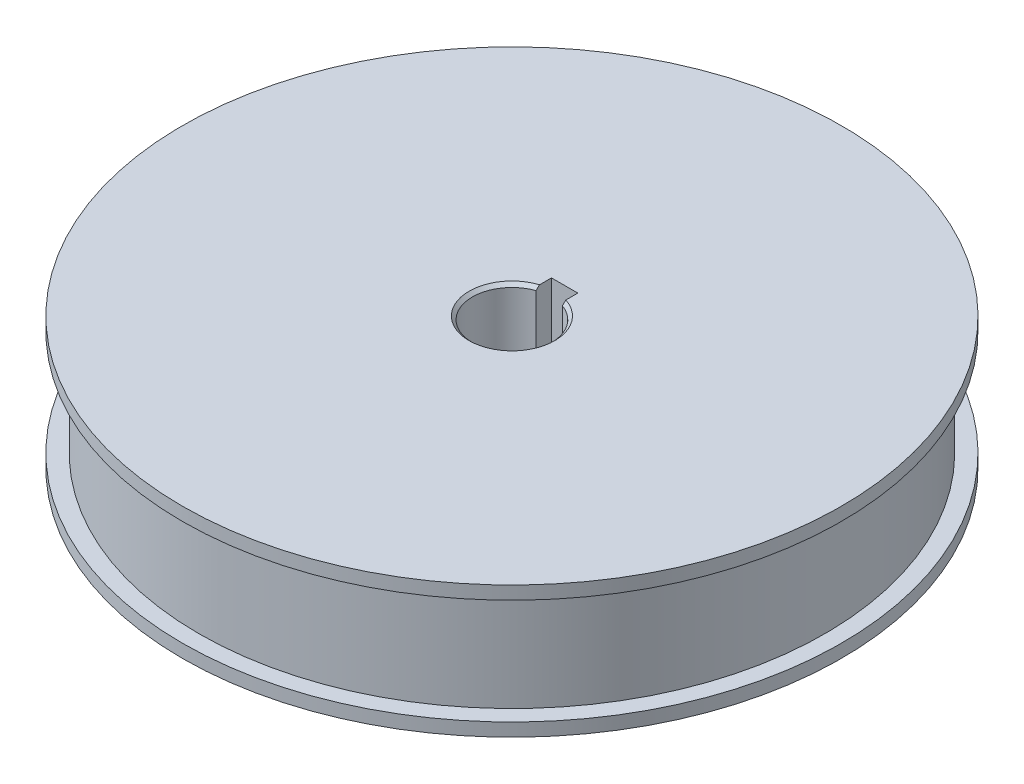
ISO-10303-21;
HEADER;
FILE_DESCRIPTION(('STEP AP214'),'2;1');
FILE_NAME('part.step','',(''),(''),'','','');
FILE_SCHEMA(('AUTOMOTIVE_DESIGN { 1 0 10303 214 1 1 1 1 }'));
ENDSEC;
DATA;
#1=APPLICATION_CONTEXT('core data for automotive mechanical design processes');
#2=APPLICATION_PROTOCOL_DEFINITION('international standard','automotive_design',2000,#1);
#3=PRODUCT_CONTEXT('',#1,'mechanical');
#4=PRODUCT('Part','Part','',(#3));
#5=PRODUCT_RELATED_PRODUCT_CATEGORY('part','',(#4));
#6=PRODUCT_DEFINITION_FORMATION('','',#4);
#7=PRODUCT_DEFINITION_CONTEXT('part definition',#1,'design');
#8=PRODUCT_DEFINITION('design','',#6,#7);
#9=PRODUCT_DEFINITION_SHAPE('','',#8);
#10=(LENGTH_UNIT() NAMED_UNIT(*) SI_UNIT(.MILLI.,.METRE.));
#11=(NAMED_UNIT(*) PLANE_ANGLE_UNIT() SI_UNIT($,.RADIAN.));
#12=(NAMED_UNIT(*) SI_UNIT($,.STERADIAN.) SOLID_ANGLE_UNIT());
#13=UNCERTAINTY_MEASURE_WITH_UNIT(LENGTH_MEASURE(1.E-05),#10,'distance_accuracy_value','');
#14=(GEOMETRIC_REPRESENTATION_CONTEXT(3) GLOBAL_UNCERTAINTY_ASSIGNED_CONTEXT((#13)) GLOBAL_UNIT_ASSIGNED_CONTEXT((#10,
#11,#12)) REPRESENTATION_CONTEXT('',''));
#15=CARTESIAN_POINT('',(0.,0.,0.));
#16=DIRECTION('',(0.,0.,1.));
#17=DIRECTION('',(1.,0.,0.));
#18=AXIS2_PLACEMENT_3D('',#15,#16,#17);
#19=CARTESIAN_POINT('',(0.,20.,0.));
#20=DIRECTION('',(0.,-1.,0.));
#21=DIRECTION('',(0.,0.,-1.));
#22=AXIS2_PLACEMENT_3D('',#19,#20,#21);
#23=CYLINDRICAL_SURFACE('',#22,50.);
#24=CARTESIAN_POINT('',(0.,0.,0.));
#25=DIRECTION('',(0.,1.,0.));
#26=DIRECTION('',(0.,0.,1.));
#27=AXIS2_PLACEMENT_3D('',#24,#25,#26);
#28=CIRCLE('',#27,50.);
#29=CARTESIAN_POINT('',(0.,0.,50.));
#30=VERTEX_POINT('',#29);
#31=EDGE_CURVE('E156',#30,#30,#28,.T.);
#32=ORIENTED_EDGE('',*,*,#31,.T.);
#33=EDGE_LOOP('',(#32));
#34=FACE_BOUND('',#33,.T.);
#35=CARTESIAN_POINT('',(0.,2.,0.));
#36=DIRECTION('',(0.,1.,0.));
#37=DIRECTION('',(0.,0.,1.));
#38=AXIS2_PLACEMENT_3D('',#35,#36,#37);
#39=CIRCLE('',#38,50.);
#40=CARTESIAN_POINT('',(0.,2.,50.));
#41=VERTEX_POINT('',#40);
#42=EDGE_CURVE('E159',#41,#41,#39,.T.);
#43=ORIENTED_EDGE('',*,*,#42,.F.);
#44=EDGE_LOOP('',(#43));
#45=FACE_BOUND('',#44,.T.);
#46=ADVANCED_FACE('F33',(#34,#45),#23,.T.);
#47=CARTESIAN_POINT('',(0.,0.,0.));
#48=DIRECTION('',(0.,1.,0.));
#49=DIRECTION('',(0.,0.,1.));
#50=AXIS2_PLACEMENT_3D('',#47,#48,#49);
#51=PLANE('',#50);
#52=DIRECTION('',(-1.,0.,0.));
#53=VECTOR('',#52,1.);
#54=CARTESIAN_POINT('',(2.,0.,-8.));
#55=LINE('',#54,#53);
#56=CARTESIAN_POINT('',(2.,0.,-8.));
#57=VERTEX_POINT('',#56);
#58=CARTESIAN_POINT('',(-2.,0.,-8.));
#59=VERTEX_POINT('',#58);
#60=EDGE_CURVE('E100',#57,#59,#55,.T.);
#61=ORIENTED_EDGE('',*,*,#60,.T.);
#62=DIRECTION('',(0.,0.,1.));
#63=VECTOR('',#62,1.);
#64=CARTESIAN_POINT('',(-2.,0.,0.342964167323017));
#65=LINE('',#64,#63);
#66=CARTESIAN_POINT('',(-2.,0.,-6.18465843842645));
#67=VERTEX_POINT('',#66);
#68=EDGE_CURVE('E113',#59,#67,#65,.T.);
#69=ORIENTED_EDGE('',*,*,#68,.T.);
#70=CARTESIAN_POINT('',(0.,0.,0.));
#71=DIRECTION('',(0.,1.,0.));
#72=DIRECTION('',(0.,0.,1.));
#73=AXIS2_PLACEMENT_3D('',#70,#71,#72);
#74=CIRCLE('',#73,6.49999999999996);
#75=CARTESIAN_POINT('',(2.,0.,-6.18465843842645));
#76=VERTEX_POINT('',#75);
#77=EDGE_CURVE('E112',#67,#76,#74,.T.);
#78=ORIENTED_EDGE('',*,*,#77,.T.);
#79=DIRECTION('',(0.,0.,-1.));
#80=VECTOR('',#79,1.);
#81=CARTESIAN_POINT('',(2.,0.,0.342964167323017));
#82=LINE('',#81,#80);
#83=EDGE_CURVE('E92',#76,#57,#82,.T.);
#84=ORIENTED_EDGE('',*,*,#83,.T.);
#85=EDGE_LOOP('',(#61,#69,#78,#84));
#86=FACE_BOUND('',#85,.T.);
#87=ORIENTED_EDGE('',*,*,#31,.F.);
#88=EDGE_LOOP('',(#87));
#89=FACE_BOUND('',#88,.T.);
#90=ADVANCED_FACE('F109',(#86,#89),#51,.F.);
#91=CARTESIAN_POINT('',(0.,2.,0.));
#92=DIRECTION('',(0.,1.,0.));
#93=DIRECTION('',(0.,0.,1.));
#94=AXIS2_PLACEMENT_3D('',#91,#92,#93);
#95=PLANE('',#94);
#96=CARTESIAN_POINT('',(0.,2.,0.));
#97=DIRECTION('',(0.,1.,0.));
#98=DIRECTION('',(0.,0.,1.));
#99=AXIS2_PLACEMENT_3D('',#96,#97,#98);
#100=CIRCLE('',#99,47.5);
#101=CARTESIAN_POINT('',(0.,2.,47.5));
#102=VERTEX_POINT('',#101);
#103=EDGE_CURVE('E165',#102,#102,#100,.T.);
#104=ORIENTED_EDGE('',*,*,#103,.F.);
#105=EDGE_LOOP('',(#104));
#106=FACE_BOUND('',#105,.T.);
#107=ORIENTED_EDGE('',*,*,#42,.T.);
#108=EDGE_LOOP('',(#107));
#109=FACE_BOUND('',#108,.T.);
#110=ADVANCED_FACE('F199',(#106,#109),#95,.T.);
#111=CARTESIAN_POINT('',(0.,18.,0.));
#112=DIRECTION('',(0.,1.,0.));
#113=DIRECTION('',(0.,0.,1.));
#114=AXIS2_PLACEMENT_3D('',#111,#112,#113);
#115=PLANE('',#114);
#116=CARTESIAN_POINT('',(0.,18.,0.));
#117=DIRECTION('',(0.,1.,0.));
#118=DIRECTION('',(0.,0.,1.));
#119=AXIS2_PLACEMENT_3D('',#116,#117,#118);
#120=CIRCLE('',#119,47.5);
#121=CARTESIAN_POINT('',(0.,18.,47.5));
#122=VERTEX_POINT('',#121);
#123=EDGE_CURVE('E168',#122,#122,#120,.T.);
#124=ORIENTED_EDGE('',*,*,#123,.T.);
#125=EDGE_LOOP('',(#124));
#126=FACE_BOUND('',#125,.T.);
#127=CARTESIAN_POINT('',(0.,18.,0.));
#128=DIRECTION('',(0.,1.,0.));
#129=DIRECTION('',(0.,0.,1.));
#130=AXIS2_PLACEMENT_3D('',#127,#128,#129);
#131=CIRCLE('',#130,50.);
#132=CARTESIAN_POINT('',(0.,18.,50.));
#133=VERTEX_POINT('',#132);
#134=EDGE_CURVE('E162',#133,#133,#131,.T.);
#135=ORIENTED_EDGE('',*,*,#134,.F.);
#136=EDGE_LOOP('',(#135));
#137=FACE_BOUND('',#136,.T.);
#138=ADVANCED_FACE('F213',(#126,#137),#115,.F.);
#139=CARTESIAN_POINT('',(0.,2.,0.));
#140=DIRECTION('',(0.,1.,0.));
#141=DIRECTION('',(0.,0.,1.));
#142=AXIS2_PLACEMENT_3D('',#139,#140,#141);
#143=CYLINDRICAL_SURFACE('',#142,47.5);
#144=ORIENTED_EDGE('',*,*,#103,.T.);
#145=EDGE_LOOP('',(#144));
#146=FACE_BOUND('',#145,.T.);
#147=ORIENTED_EDGE('',*,*,#123,.F.);
#148=EDGE_LOOP('',(#147));
#149=FACE_BOUND('',#148,.T.);
#150=ADVANCED_FACE('F207',(#146,#149),#143,.T.);
#151=CARTESIAN_POINT('',(0.,20.,0.));
#152=DIRECTION('',(0.,1.,0.));
#153=DIRECTION('',(0.,0.,1.));
#154=AXIS2_PLACEMENT_3D('',#151,#152,#153);
#155=PLANE('',#154);
#156=DIRECTION('',(0.,0.,1.));
#157=VECTOR('',#156,1.);
#158=CARTESIAN_POINT('',(-2.,20.,0.342964167323017));
#159=LINE('',#158,#157);
#160=CARTESIAN_POINT('',(-2.,20.,-8.));
#161=VERTEX_POINT('',#160);
#162=CARTESIAN_POINT('',(-2.,20.,-6.18465843842651));
#163=VERTEX_POINT('',#162);
#164=EDGE_CURVE('E118',#161,#163,#159,.T.);
#165=ORIENTED_EDGE('',*,*,#164,.F.);
#166=DIRECTION('',(-1.,0.,0.));
#167=VECTOR('',#166,1.);
#168=CARTESIAN_POINT('',(2.,20.,-8.));
#169=LINE('',#168,#167);
#170=CARTESIAN_POINT('',(2.,20.,-8.));
#171=VERTEX_POINT('',#170);
#172=EDGE_CURVE('E115',#171,#161,#169,.T.);
#173=ORIENTED_EDGE('',*,*,#172,.F.);
#174=DIRECTION('',(0.,0.,-1.));
#175=VECTOR('',#174,1.);
#176=CARTESIAN_POINT('',(2.,20.,0.342964167323017));
#177=LINE('',#176,#175);
#178=CARTESIAN_POINT('',(2.,20.,-6.18465843842651));
#179=VERTEX_POINT('',#178);
#180=EDGE_CURVE('E95',#179,#171,#177,.T.);
#181=ORIENTED_EDGE('',*,*,#180,.F.);
#182=CARTESIAN_POINT('',(0.,20.,0.));
#183=DIRECTION('',(0.,1.,0.));
#184=DIRECTION('',(0.,0.,1.));
#185=AXIS2_PLACEMENT_3D('',#182,#183,#184);
#186=CIRCLE('',#185,6.50000000000002);
#187=EDGE_CURVE('E145',#179,#163,#186,.F.);
#188=ORIENTED_EDGE('',*,*,#187,.T.);
#189=EDGE_LOOP('',(#165,#173,#181,#188));
#190=FACE_BOUND('',#189,.T.);
#191=CARTESIAN_POINT('',(0.,20.,0.));
#192=DIRECTION('',(0.,1.,0.));
#193=DIRECTION('',(0.,0.,1.));
#194=AXIS2_PLACEMENT_3D('',#191,#192,#193);
#195=CIRCLE('',#194,50.);
#196=CARTESIAN_POINT('',(0.,20.,50.));
#197=VERTEX_POINT('',#196);
#198=EDGE_CURVE('E155',#197,#197,#195,.T.);
#199=ORIENTED_EDGE('',*,*,#198,.T.);
#200=EDGE_LOOP('',(#199));
#201=FACE_BOUND('',#200,.T.);
#202=ADVANCED_FACE('F185',(#190,#201),#155,.T.);
#203=ORIENTED_EDGE('',*,*,#134,.T.);
#204=EDGE_LOOP('',(#203));
#205=FACE_BOUND('',#204,.T.);
#206=ORIENTED_EDGE('',*,*,#198,.F.);
#207=EDGE_LOOP('',(#206));
#208=FACE_BOUND('',#207,.T.);
#209=ADVANCED_FACE('F193',(#205,#208),#23,.T.);
#210=CARTESIAN_POINT('',(0.,0.,0.));
#211=DIRECTION('',(0.,1.,0.));
#212=DIRECTION('',(0.,0.,1.));
#213=AXIS2_PLACEMENT_3D('',#210,#211,#212);
#214=CYLINDRICAL_SURFACE('',#213,6.);
#215=CARTESIAN_POINT('',(0.,0.499999999999969,0.));
#216=DIRECTION('',(0.,1.,0.));
#217=DIRECTION('',(0.,0.,1.));
#218=AXIS2_PLACEMENT_3D('',#215,#216,#217);
#219=CIRCLE('',#218,6.);
#220=CARTESIAN_POINT('',(2.,0.499999999999969,-5.65685424949238));
#221=VERTEX_POINT('',#220);
#222=CARTESIAN_POINT('',(-2.,0.499999999999969,-5.65685424949238));
#223=VERTEX_POINT('',#222);
#224=EDGE_CURVE('E148',#221,#223,#219,.F.);
#225=ORIENTED_EDGE('',*,*,#224,.T.);
#226=DIRECTION('',(0.,1.,0.));
#227=VECTOR('',#226,1.);
#228=CARTESIAN_POINT('',(-2.,0.,-5.65685424949238));
#229=LINE('',#228,#227);
#230=CARTESIAN_POINT('',(-2.,19.5,-5.65685424949238));
#231=VERTEX_POINT('',#230);
#232=EDGE_CURVE('E60',#223,#231,#229,.T.);
#233=ORIENTED_EDGE('',*,*,#232,.T.);
#234=CARTESIAN_POINT('',(0.,19.5,0.));
#235=DIRECTION('',(0.,1.,0.));
#236=DIRECTION('',(0.,0.,1.));
#237=AXIS2_PLACEMENT_3D('',#234,#235,#236);
#238=CIRCLE('',#237,6.);
#239=CARTESIAN_POINT('',(2.,19.5,-5.65685424949238));
#240=VERTEX_POINT('',#239);
#241=EDGE_CURVE('E151',#231,#240,#238,.T.);
#242=ORIENTED_EDGE('',*,*,#241,.T.);
#243=DIRECTION('',(0.,1.,0.));
#244=VECTOR('',#243,1.);
#245=CARTESIAN_POINT('',(2.,0.,-5.65685424949238));
#246=LINE('',#245,#244);
#247=EDGE_CURVE('E53',#240,#221,#246,.F.);
#248=ORIENTED_EDGE('',*,*,#247,.T.);
#249=EDGE_LOOP('',(#225,#233,#242,#248));
#250=FACE_BOUND('',#249,.T.);
#251=ADVANCED_FACE('F178',(#250),#214,.F.);
#252=CARTESIAN_POINT('',(0.,0.,0.));
#253=DIRECTION('',(0.,-1.,0.));
#254=DIRECTION('',(0.,0.,-1.));
#255=AXIS2_PLACEMENT_3D('',#252,#253,#254);
#256=CONICAL_SURFACE('',#255,6.49999999999996,0.785398163397442);
#257=CARTESIAN_POINT('',(-2.,1.61219853949245,4.45988824045397));
#258=CARTESIAN_POINT('',(-2.,1.73160057225468,4.32899011369741));
#259=CARTESIAN_POINT('',(-2.,1.85056308903736,4.19768461100457));
#260=CARTESIAN_POINT('',(-2.,2.08726565906151,3.93391719229734));
#261=CARTESIAN_POINT('',(-2.,2.20500539441447,3.80145499127349));
#262=CARTESIAN_POINT('',(-2.,2.43969910927223,3.53414060830021));
#263=CARTESIAN_POINT('',(-2.,2.55664134359573,3.39927808842488));
#264=CARTESIAN_POINT('',(-2.,2.78825316106572,3.127638499899));
#265=CARTESIAN_POINT('',(-2.,2.90292304645967,2.99086169005596));
#266=CARTESIAN_POINT('',(-2.,3.11213084814838,2.7353600215693));
#267=CARTESIAN_POINT('',(-2.,3.20711197924624,2.61699922173352));
#268=CARTESIAN_POINT('',(-2.,3.3938514240401,2.37776497397293));
#269=CARTESIAN_POINT('',(-2.,3.48561008501234,2.25689179904818));
#270=CARTESIAN_POINT('',(-2.,3.66439216862294,2.01188713856589));
#271=CARTESIAN_POINT('',(-2.,3.75142098300241,1.8877596127775));
#272=CARTESIAN_POINT('',(-2.,3.91853651086337,1.63493155293843));
#273=CARTESIAN_POINT('',(-2.,3.99862775346176,1.50623408090329));
#274=CARTESIAN_POINT('',(-2.,4.10958063467165,1.31029101943208));
#275=CARTESIAN_POINT('',(-2.,4.14460499315393,1.24542093565854));
#276=CARTESIAN_POINT('',(-2.,4.21137082813927,1.11401979859999));
#277=CARTESIAN_POINT('',(-2.,4.2431116718963,1.04748842823361));
#278=CARTESIAN_POINT('',(-2.,4.33206214489695,0.845313798015475));
#279=CARTESIAN_POINT('',(-2.,4.38319962235176,0.706754073601495));
#280=CARTESIAN_POINT('',(-2.,4.43739564157709,0.507342393878112));
#281=CARTESIAN_POINT('',(-2.,4.45095785902955,0.449303455964828));
#282=CARTESIAN_POINT('',(-2.,4.4733877046244,0.33233526442306));
#283=CARTESIAN_POINT('',(-2.,4.48225768211542,0.273406471565288));
#284=CARTESIAN_POINT('',(-2.,4.49485693183785,0.15508721821775));
#285=CARTESIAN_POINT('',(-2.,4.49859409193038,0.0956976074721));
#286=CARTESIAN_POINT('',(-2.,4.50074862203906,-0.0231805731579565));
#287=CARTESIAN_POINT('',(-2.,4.4991659564945,-0.0826691437012093));
#288=CARTESIAN_POINT('',(-2.,4.49077679957134,-0.20116021652316));
#289=CARTESIAN_POINT('',(-2.,4.48397996201615,-0.260163413631012));
#290=CARTESIAN_POINT('',(-2.,4.46552667480977,-0.377407356251951));
#291=CARTESIAN_POINT('',(-2.,4.45386911941681,-0.435647925167084));
#292=CARTESIAN_POINT('',(-2.,4.42619592536784,-0.551197583851442));
#293=CARTESIAN_POINT('',(-2.,4.41017140301754,-0.608504519708594));
#294=CARTESIAN_POINT('',(-2.,4.3743771185397,-0.721920663509619));
#295=CARTESIAN_POINT('',(-2.,4.35460744386474,-0.778029899386801));
#296=CARTESIAN_POINT('',(-2.,4.30484491880407,-0.90739085041634));
#297=CARTESIAN_POINT('',(-2.,4.27363380956965,-0.980171948387721));
#298=CARTESIAN_POINT('',(-2.,4.20682027827652,-1.12370429686066));
#299=CARTESIAN_POINT('',(-2.,4.17121560537904,-1.19445448385073));
#300=CARTESIAN_POINT('',(-2.,4.09652028280135,-1.33424550496522));
#301=CARTESIAN_POINT('',(-2.,4.05742326062341,-1.40328290800829));
#302=CARTESIAN_POINT('',(-2.,3.97653851955975,-1.53976578360353));
#303=CARTESIAN_POINT('',(-2.,3.93475040628739,-1.60721102083118));
#304=CARTESIAN_POINT('',(-2.,3.84869069773078,-1.74129415102359));
#305=CARTESIAN_POINT('',(-2.,3.80440116604976,-1.80792047750683));
#306=CARTESIAN_POINT('',(-2.,3.71409789436585,-1.93999261528823));
#307=CARTESIAN_POINT('',(-2.,3.66808410193195,-2.00543839059863));
#308=CARTESIAN_POINT('',(-2.,3.57472308074126,-2.13524623127281));
#309=CARTESIAN_POINT('',(-2.,3.52737757205937,-2.19960953717343));
#310=CARTESIAN_POINT('',(-2.,3.43155148379208,-2.32747983180517));
#311=CARTESIAN_POINT('',(-2.,3.38307094315218,-2.39098684979994));
#312=CARTESIAN_POINT('',(-2.,3.2237752593542,-2.5964946011706));
#313=CARTESIAN_POINT('',(-2.,3.11105814905099,-2.73702084589685));
#314=CARTESIAN_POINT('',(-2.,2.88243857479556,-3.01546454371718));
#315=CARTESIAN_POINT('',(-2.,2.76653571004763,-3.15338166484171));
#316=CARTESIAN_POINT('',(-2.,2.5324351476168,-3.4273363698164));
#317=CARTESIAN_POINT('',(-2.,2.41423663670568,-3.56337325727129));
#318=CARTESIAN_POINT('',(-2.,2.17618407248154,-3.83399275017562));
#319=CARTESIAN_POINT('',(-2.,2.05632997605792,-3.96857531759203));
#320=CARTESIAN_POINT('',(-2.,1.69458161651471,-4.37104314109603));
#321=CARTESIAN_POINT('',(-2.,1.45083577632547,-4.63726233478265));
#322=CARTESIAN_POINT('',(-2.,0.9604324594057,-5.16688171006759));
#323=CARTESIAN_POINT('',(-2.,0.713775631542884,-5.43028249583973));
#324=CARTESIAN_POINT('',(-2.,0.219628499894256,-5.95403724989811));
#325=CARTESIAN_POINT('',(-2.,-0.0278528962180387,-6.21439963003504));
#326=CARTESIAN_POINT('',(-2.,-0.524169948264208,-6.73385597358412));
#327=CARTESIAN_POINT('',(-2.,-0.773005678360163,-6.99294986602891));
#328=CARTESIAN_POINT('',(-2.,-1.27148732458179,-7.51004188490894));
#329=CARTESIAN_POINT('',(-2.,-1.52113263197186,-7.76804059853803));
#330=CARTESIAN_POINT('',(-2.,-2.02114182797931,-8.28334078464484));
#331=CARTESIAN_POINT('',(-2.,-2.27150571713954,-8.54064225659556));
#332=CARTESIAN_POINT('',(-2.,-2.65469969361488,-8.93361228298925));
#333=CARTESIAN_POINT('',(-2.,-2.78733170977238,-9.06947408992298));
#334=CARTESIAN_POINT('',(-2.,-3.05274477408878,-9.34107945740285));
#335=CARTESIAN_POINT('',(-2.,-3.18552583620758,-9.47682300430818));
#336=CARTESIAN_POINT('',(-2.,-3.45135596100367,-9.74834609038349));
#337=CARTESIAN_POINT('',(-2.,-3.58440515719579,-9.88412549882043));
#338=CARTESIAN_POINT('',(-2.,-3.85059551613597,-10.1555664279706));
#339=CARTESIAN_POINT('',(-2.,-3.98373666787464,-10.2912279594799));
#340=CARTESIAN_POINT('',(-2.,-4.11692407313095,-10.4268440467203));
#341=B_SPLINE_CURVE_WITH_KNOTS('',3,(#257,#258,#259,#260,#261,#262,#263,#264,#265,#266,#267,
#268,#269,#270,#271,#272,#273,#274,#275,#276,#277,#278,#279,#280,#281,#282,#283,#284,#285,#286,
#287,#288,#289,#290,#291,#292,#293,#294,#295,#296,#297,#298,#299,#300,#301,#302,#303,#304,#305,
#306,#307,#308,#309,#310,#311,#312,#313,#314,#315,#316,#317,#318,#319,#320,#321,#322,#323,#324,
#325,#326,#327,#328,#329,#330,#331,#332,#333,#334,#335,#336,#337,#338,#339,#340),.UNSPECIFIED.,
.F.,.F.,(4,2,2,2,2,2,2,2,2,2,2,2,2,2,2,2,2,2,2,2,2,2,2,2,2,2,2,2,2,2,2,2,2,2,2,2,2,2,2,2,2,4),
(0.,0.531532800104079,1.06320048846525,1.59869277855567,2.13411335759058,2.58935213474305,
3.04454170064137,3.49920099832056,3.95356120377446,4.17463437668464,4.39575007220395,
4.83681348384999,5.01546676449134,5.19403051069923,5.37231954073346,5.55060976255398,
5.72857068172189,5.90657210648615,6.08493837695391,6.26330048292644,6.50067719750104,
6.73817602988312,6.97611744289256,7.21409380656477,7.45407234096785,7.69405817852275,
7.93374711955648,8.17342784834479,8.71378626964112,9.25421298674594,9.79483477299652,
10.3354706634045,11.4182748776934,12.5008421268164,13.5784805496539,14.6561785889065,
15.7331981047259,16.8102184343717,17.3798209760955,17.9494822650366,18.5197832035638,
19.0900248030533),.UNSPECIFIED.);
#342=EDGE_CURVE('E171',#223,#67,#341,.T.);
#343=ORIENTED_EDGE('',*,*,#342,.F.);
#344=ORIENTED_EDGE('',*,*,#224,.F.);
#345=CARTESIAN_POINT('',(2.,-4.11692407313095,-10.4268440467203));
#346=CARTESIAN_POINT('',(2.,-3.85202515936052,-10.1571023080294));
#347=CARTESIAN_POINT('',(2.,-3.58729863804241,-9.88719081066195));
#348=CARTESIAN_POINT('',(2.,-3.05797214945071,-9.34654685306115));
#349=CARTESIAN_POINT('',(2.,-2.79337280849998,-9.0758137797134));
#350=CARTESIAN_POINT('',(2.,-2.25874894420904,-8.52756944785167));
#351=CARTESIAN_POINT('',(2.,-1.98873843460707,-8.25004451756953));
#352=CARTESIAN_POINT('',(2.,-1.44992460173528,-7.69453582748563));
#353=CARTESIAN_POINT('',(2.,-1.1811201548436,-7.41655315835108));
#354=CARTESIAN_POINT('',(2.,-0.682974243380568,-6.89922202345327));
#355=CARTESIAN_POINT('',(2.,-0.45347725443928,-6.66002339323314));
#356=CARTESIAN_POINT('',(2.,0.00437928087560684,-6.18046866542998));
#357=CARTESIAN_POINT('',(2.,0.232738648093766,-5.94011239657435));
#358=CARTESIAN_POINT('',(2.,0.688968515011236,-5.45660459018517));
#359=CARTESIAN_POINT('',(2.,0.916830533467052,-5.21344504262601));
#360=CARTESIAN_POINT('',(2.,1.36997587422681,-4.72499129668505));
#361=CARTESIAN_POINT('',(2.,1.59526063599425,-4.4796984396151));
#362=CARTESIAN_POINT('',(2.,1.9280019823299,-4.11166588182012));
#363=CARTESIAN_POINT('',(2.,2.03692758091937,-3.99025528525912));
#364=CARTESIAN_POINT('',(2.,2.25357617960902,-3.74636702329595));
#365=CARTESIAN_POINT('',(2.,2.36129919646389,-3.62388937280268));
#366=CARTESIAN_POINT('',(2.,2.57542832660804,-3.3772793203824));
#367=CARTESIAN_POINT('',(2.,2.68183074718853,-3.25314370434691));
#368=CARTESIAN_POINT('',(2.,2.89250066151554,-3.00309750154677));
#369=CARTESIAN_POINT('',(2.,2.99676844412284,-2.87718715888536));
#370=CARTESIAN_POINT('',(2.,3.20133882649366,-2.62424401698871));
#371=CARTESIAN_POINT('',(2.,3.30167062082191,-2.49723497439838));
#372=CARTESIAN_POINT('',(2.,3.49824932113247,-2.2399575215414));
#373=CARTESIAN_POINT('',(2.,3.5944937192554,-2.10968718600972));
#374=CARTESIAN_POINT('',(2.,3.78043068619411,-1.8452432925981));
#375=CARTESIAN_POINT('',(2.,3.87014802721925,-1.71108752164307));
#376=CARTESIAN_POINT('',(2.,3.99734057547431,-1.50537945514365));
#377=CARTESIAN_POINT('',(2.,4.0384876623721,-1.43610225807613));
#378=CARTESIAN_POINT('',(2.,4.1176320233952,-1.29577923499182));
#379=CARTESIAN_POINT('',(2.,4.15563034937219,-1.2247340099857));
#380=CARTESIAN_POINT('',(2.,4.20707850492364,-1.12169806046594));
#381=CARTESIAN_POINT('',(2.,4.22217634123454,-1.09052658547134));
#382=CARTESIAN_POINT('',(2.,4.25154151755371,-1.02778171028063));
#383=CARTESIAN_POINT('',(2.,4.26580859774857,-0.996208188069378));
#384=CARTESIAN_POINT('',(2.,4.29341241233352,-0.9326562543702));
#385=CARTESIAN_POINT('',(2.,4.30674916372379,-0.900677850293427));
#386=CARTESIAN_POINT('',(2.,4.33238724140896,-0.836311295861495));
#387=CARTESIAN_POINT('',(2.,4.34468860996275,-0.803923162291467));
#388=CARTESIAN_POINT('',(2.,4.37957529298804,-0.706969524010819));
#389=CARTESIAN_POINT('',(2.,4.40050511373331,-0.641793724194985));
#390=CARTESIAN_POINT('',(2.,4.43698844324685,-0.509926685960209));
#391=CARTESIAN_POINT('',(2.,4.45254150468695,-0.443235321943141));
#392=CARTESIAN_POINT('',(2.,4.47563715505322,-0.318221709920715));
#393=CARTESIAN_POINT('',(2.,4.48400252483829,-0.260052603225496));
#394=CARTESIAN_POINT('',(2.,4.49572002905261,-0.143222422036379));
#395=CARTESIAN_POINT('',(2.,4.49907383553637,-0.084561518196953));
#396=CARTESIAN_POINT('',(2.,4.50059130770833,0.0328027447906741));
#397=CARTESIAN_POINT('',(2.,4.49875728076068,0.0915060734588462));
#398=CARTESIAN_POINT('',(2.,4.49000522758415,0.208537617000397));
#399=CARTESIAN_POINT('',(2.,4.48308599970052,0.266865739924182));
#400=CARTESIAN_POINT('',(2.,4.46182848062896,0.399458602786358));
#401=CARTESIAN_POINT('',(2.,4.44592700484639,0.47347304753199));
#402=CARTESIAN_POINT('',(2.,4.40737583003711,0.619732056134578));
#403=CARTESIAN_POINT('',(2.,4.38472157895893,0.691975390418867));
#404=CARTESIAN_POINT('',(2.,4.33376774844008,0.834895213932325));
#405=CARTESIAN_POINT('',(2.,4.30543567423359,0.905559954814699));
#406=CARTESIAN_POINT('',(2.,4.24435755598113,1.04491186091865));
#407=CARTESIAN_POINT('',(2.,4.21161240424251,1.11359942251984));
#408=CARTESIAN_POINT('',(2.,4.11898520527817,1.29574813474842));
#409=CARTESIAN_POINT('',(2.,4.05590573725121,1.40757554489782));
#410=CARTESIAN_POINT('',(2.,3.9231210763619,1.62725093074807));
#411=CARTESIAN_POINT('',(2.,3.85341072879622,1.73509571853254));
#412=CARTESIAN_POINT('',(2.,3.70923615968444,1.94794770463543));
#413=CARTESIAN_POINT('',(2.,3.63475999771598,2.05294675624234));
#414=CARTESIAN_POINT('',(2.,3.48256784869033,2.26050101482551));
#415=CARTESIAN_POINT('',(2.,3.40485288415533,2.36305697727826));
#416=CARTESIAN_POINT('',(2.,3.24672814740809,2.56669184397754));
#417=CARTESIAN_POINT('',(2.,3.16630920580189,2.66776359933968));
#418=CARTESIAN_POINT('',(2.,3.00364765519351,2.86843448950422));
#419=CARTESIAN_POINT('',(2.,2.92140492673219,2.96803352712629));
#420=CARTESIAN_POINT('',(2.,2.67283107060704,3.26481029636765));
#421=CARTESIAN_POINT('',(2.,2.50442941582736,3.46025193007642));
#422=CARTESIAN_POINT('',(2.,2.21503187212977,3.79013784222473));
#423=CARTESIAN_POINT('',(2.,2.09490935345996,3.92535560089502));
#424=CARTESIAN_POINT('',(2.,1.85407281596989,4.19381458757091));
#425=CARTESIAN_POINT('',(2.,1.73336657942019,4.32706279073908));
#426=CARTESIAN_POINT('',(2.,1.61219853949246,4.45988824045397));
#427=B_SPLINE_CURVE_WITH_KNOTS('',3,(#345,#346,#347,#348,#349,#350,#351,#352,#353,#354,#355,
#356,#357,#358,#359,#360,#361,#362,#363,#364,#365,#366,#367,#368,#369,#370,#371,#372,#373,#374,
#375,#376,#377,#378,#379,#380,#381,#382,#383,#384,#385,#386,#387,#388,#389,#390,#391,#392,#393,
#394,#395,#396,#397,#398,#399,#400,#401,#402,#403,#404,#405,#406,#407,#408,#409,#410,#411,#412,
#413,#414,#415,#416,#417,#418,#419,#420,#421,#422,#423,#424,#425,#426),.UNSPECIFIED.,.F.,.F.,(4,
2,2,2,2,2,2,2,2,2,2,2,2,2,2,2,2,2,2,2,2,2,2,2,2,2,2,2,2,2,2,2,2,2,2,2,2,2,2,2,4),(0.,
1.13419103995077,2.26987647837236,3.43148263903973,4.59155406361129,5.58601791976477,
6.58063372666599,7.58033912968272,8.57945585265289,9.06878409788466,9.55810551713819,
10.0485776696297,10.5389830064075,11.0244922356522,11.5102951723551,11.994146088969,
12.2358155581733,12.477403968865,12.5813001142691,12.6852285798832,12.7891551458828,
12.8930774680873,13.0982356581208,13.3034109125155,13.4795136811312,13.6555576818122,
13.8315233966841,14.0075307063827,14.2342487739012,14.4611200192186,14.6893287892123,
14.9174914853031,15.3022859411861,15.6873820114976,16.073483856723,16.4594647157235,
16.8469217260419,17.2344041904311,18.00828228075,18.5508809615197,19.0902484404755),.UNSPECIFIED.);
#428=EDGE_CURVE('E124',#76,#221,#427,.T.);
#429=ORIENTED_EDGE('',*,*,#428,.F.);
#430=ORIENTED_EDGE('',*,*,#77,.F.);
#431=EDGE_LOOP('',(#343,#344,#429,#430));
#432=FACE_BOUND('',#431,.T.);
#433=ADVANCED_FACE('F131',(#432),#256,.F.);
#434=CARTESIAN_POINT('',(0.,19.5,0.));
#435=DIRECTION('',(0.,1.,0.));
#436=DIRECTION('',(0.,0.,1.));
#437=AXIS2_PLACEMENT_3D('',#434,#435,#436);
#438=CONICAL_SURFACE('',#437,6.,0.785398163397467);
#439=CARTESIAN_POINT('',(-2.,24.116924073131,-10.4268440467206));
#440=CARTESIAN_POINT('',(-2.,23.8520251593606,-10.1571023080297));
#441=CARTESIAN_POINT('',(-2.,23.5872986380425,-9.88719081066225));
#442=CARTESIAN_POINT('',(-2.,23.0579721494508,-9.34654685306144));
#443=CARTESIAN_POINT('',(-2.,22.7933728085001,-9.0758137797137));
#444=CARTESIAN_POINT('',(-2.,22.2587489442092,-8.52756944785196));
#445=CARTESIAN_POINT('',(-2.,21.9887384346072,-8.25004451756982));
#446=CARTESIAN_POINT('',(-2.,21.4499246017354,-7.69453582748592));
#447=CARTESIAN_POINT('',(-2.,21.1811201548438,-7.41655315835137));
#448=CARTESIAN_POINT('',(-2.,20.6829742433807,-6.89922202345354));
#449=CARTESIAN_POINT('',(-2.,20.4534772544394,-6.6600233932334));
#450=CARTESIAN_POINT('',(-2.,19.9956207191246,-6.18046866543021));
#451=CARTESIAN_POINT('',(-2.,19.7672613519064,-5.94011239657456));
#452=CARTESIAN_POINT('',(-2.,19.3110314849889,-5.45660459018535));
#453=CARTESIAN_POINT('',(-2.,19.0831694665331,-5.21344504262618));
#454=CARTESIAN_POINT('',(-2.,18.6300241257733,-4.72499129668519));
#455=CARTESIAN_POINT('',(-2.,18.4047393640059,-4.47969843961523));
#456=CARTESIAN_POINT('',(-2.,18.0719980176702,-4.11166588182022));
#457=CARTESIAN_POINT('',(-2.,17.9630724190808,-3.99025528525922));
#458=CARTESIAN_POINT('',(-2.,17.7464238203911,-3.74636702329603));
#459=CARTESIAN_POINT('',(-2.,17.6387008035362,-3.62388937280275));
#460=CARTESIAN_POINT('',(-2.,17.4245716733921,-3.37727932038246));
#461=CARTESIAN_POINT('',(-2.,17.3181692528116,-3.25314370434696));
#462=CARTESIAN_POINT('',(-2.,17.1074993384846,-3.00309750154681));
#463=CARTESIAN_POINT('',(-2.,17.0032315558773,-2.87718715888539));
#464=CARTESIAN_POINT('',(-2.,16.7986611735065,-2.62424401698873));
#465=CARTESIAN_POINT('',(-2.,16.6983293791782,-2.49723497439838));
#466=CARTESIAN_POINT('',(-2.,16.5017506788676,-2.23995752154139));
#467=CARTESIAN_POINT('',(-2.,16.4055062807447,-2.1096871860097));
#468=CARTESIAN_POINT('',(-2.,16.219569313806,-1.84524329259807));
#469=CARTESIAN_POINT('',(-2.,16.1298519727809,-1.71108752164303));
#470=CARTESIAN_POINT('',(-2.,16.0026594245258,-1.5053794551436));
#471=CARTESIAN_POINT('',(-2.,15.961512337628,-1.43610225807608));
#472=CARTESIAN_POINT('',(-2.,15.8823679766049,-1.29577923499176));
#473=CARTESIAN_POINT('',(-2.,15.8443696506279,-1.22473400998564));
#474=CARTESIAN_POINT('',(-2.,15.7929214950765,-1.12169806046587));
#475=CARTESIAN_POINT('',(-2.,15.7778236587656,-1.09052658547127));
#476=CARTESIAN_POINT('',(-2.,15.7484584824464,-1.02778171028056));
#477=CARTESIAN_POINT('',(-2.,15.7341914022516,-0.996208188069308));
#478=CARTESIAN_POINT('',(-2.,15.7065875876666,-0.932656254370129));
#479=CARTESIAN_POINT('',(-2.,15.6932508362763,-0.900677850293355));
#480=CARTESIAN_POINT('',(-2.,15.6676127585912,-0.836311295861421));
#481=CARTESIAN_POINT('',(-2.,15.6553113900374,-0.803923162291391));
#482=CARTESIAN_POINT('',(-2.,15.6204247070121,-0.706969524010739));
#483=CARTESIAN_POINT('',(-2.,15.5994948862668,-0.641793724194904));
#484=CARTESIAN_POINT('',(-2.,15.5630115567533,-0.509926685960126));
#485=CARTESIAN_POINT('',(-2.,15.5474584953132,-0.443235321943057));
#486=CARTESIAN_POINT('',(-2.,15.5243628449469,-0.318221709920625));
#487=CARTESIAN_POINT('',(-2.,15.5159974751619,-0.260052603225402));
#488=CARTESIAN_POINT('',(-2.,15.5042799709476,-0.143222422036278));
#489=CARTESIAN_POINT('',(-2.,15.5009261644638,-0.0845615181968489));
#490=CARTESIAN_POINT('',(-2.,15.4994086922918,0.0328027447907838));
#491=CARTESIAN_POINT('',(-2.,15.5012427192395,0.0915060734589587));
#492=CARTESIAN_POINT('',(-2.,15.509994772416,0.208537617000515));
#493=CARTESIAN_POINT('',(-2.,15.5169140002997,0.266865739924303));
#494=CARTESIAN_POINT('',(-2.,15.5381715193712,0.399458602786492));
#495=CARTESIAN_POINT('',(-2.,15.5540729951538,0.473473047532134));
#496=CARTESIAN_POINT('',(-2.,15.5926241699631,0.619732056134741));
#497=CARTESIAN_POINT('',(-2.,15.6152784210413,0.691975390419038));
#498=CARTESIAN_POINT('',(-2.,15.6662322515602,0.834895213932513));
#499=CARTESIAN_POINT('',(-2.,15.6945643257667,0.905559954814895));
#500=CARTESIAN_POINT('',(-2.,15.7556424440191,1.04491186091886));
#501=CARTESIAN_POINT('',(-2.,15.7883875957578,1.11359942252006));
#502=CARTESIAN_POINT('',(-2.,15.8810147947221,1.29574813474869));
#503=CARTESIAN_POINT('',(-2.,15.9440942627491,1.40757554489812));
#504=CARTESIAN_POINT('',(-2.,16.0768789236385,1.62725093074844));
#505=CARTESIAN_POINT('',(-2.,16.1465892712042,1.73509571853295));
#506=CARTESIAN_POINT('',(-2.,16.290763840316,1.94794770463589));
#507=CARTESIAN_POINT('',(-2.,16.3652400022845,2.05294675624285));
#508=CARTESIAN_POINT('',(-2.,16.5174321513102,2.26050101482607));
#509=CARTESIAN_POINT('',(-2.,16.5951471158452,2.36305697727885));
#510=CARTESIAN_POINT('',(-2.,16.7532718525925,2.5666918439782));
#511=CARTESIAN_POINT('',(-2.,16.8336907941988,2.66776359934037));
#512=CARTESIAN_POINT('',(-2.,16.9963523448072,2.86843448950498));
#513=CARTESIAN_POINT('',(-2.,17.0785950732685,2.96803352712708));
#514=CARTESIAN_POINT('',(-2.,17.3271689293938,3.26481029636853));
#515=CARTESIAN_POINT('',(-2.,17.4955705841735,3.46025193007737));
#516=CARTESIAN_POINT('',(-2.,17.784968127871,3.79013784222556));
#517=CARTESIAN_POINT('',(-2.,17.9050906465407,3.92535560089569));
#518=CARTESIAN_POINT('',(-2.,18.1459271840305,4.19381458757126));
#519=CARTESIAN_POINT('',(-2.,18.26663342058,4.32706279073927));
#520=CARTESIAN_POINT('',(-2.,18.3878014605076,4.459888240454));
#521=B_SPLINE_CURVE_WITH_KNOTS('',3,(#439,#440,#441,#442,#443,#444,#445,#446,#447,#448,#449,
#450,#451,#452,#453,#454,#455,#456,#457,#458,#459,#460,#461,#462,#463,#464,#465,#466,#467,#468,
#469,#470,#471,#472,#473,#474,#475,#476,#477,#478,#479,#480,#481,#482,#483,#484,#485,#486,#487,
#488,#489,#490,#491,#492,#493,#494,#495,#496,#497,#498,#499,#500,#501,#502,#503,#504,#505,#506,
#507,#508,#509,#510,#511,#512,#513,#514,#515,#516,#517,#518,#519,#520),.UNSPECIFIED.,.F.,.F.,(4,
2,2,2,2,2,2,2,2,2,2,2,2,2,2,2,2,2,2,2,2,2,2,2,2,2,2,2,2,2,2,2,2,2,2,2,2,2,2,2,4),(0.,
1.13419103995075,2.26987647837231,3.43148263903966,4.5915540636112,5.58601791976472,
6.58063372666599,7.58033912968275,8.57945585265296,9.06878409788475,9.5581055171383,
10.0485776696298,10.5389830064077,11.0244922356524,11.5102951723553,11.9941460889693,
12.2358155581735,12.4774039688652,12.5813001142693,12.6852285798834,12.789155145883,
12.8930774680875,13.098235658121,13.3034109125158,13.4795136811314,13.6555576818125,
13.8315233966844,14.0075307063829,14.2342487739015,14.4611200192189,14.6893287892126,
14.9174914853035,15.3022859411866,15.6873820114982,16.0734838567238,16.4594647157244,
16.8469217260429,17.2344041904323,18.0082822807514,18.5508809615205,19.0902484404756),.UNSPECIFIED.);
#522=EDGE_CURVE('E11',#163,#231,#521,.T.);
#523=ORIENTED_EDGE('',*,*,#522,.F.);
#524=ORIENTED_EDGE('',*,*,#187,.F.);
#525=CARTESIAN_POINT('',(2.,18.3878014605076,4.459888240454));
#526=CARTESIAN_POINT('',(2.,18.2683994277454,4.32899011369744));
#527=CARTESIAN_POINT('',(2.,18.1494369109627,4.19768461100459));
#528=CARTESIAN_POINT('',(2.,17.9127343409386,3.93391719229735));
#529=CARTESIAN_POINT('',(2.,17.7949946055856,3.8014549912735));
#530=CARTESIAN_POINT('',(2.,17.5603008907278,3.5341406083002));
#531=CARTESIAN_POINT('',(2.,17.4433586564043,3.39927808842487));
#532=CARTESIAN_POINT('',(2.,17.2117468389343,3.12763849989897));
#533=CARTESIAN_POINT('',(2.,17.0970769535404,2.99086169005593));
#534=CARTESIAN_POINT('',(2.,16.8878691518517,2.73536002156925));
#535=CARTESIAN_POINT('',(2.,16.7928880207538,2.61699922173346));
#536=CARTESIAN_POINT('',(2.,16.6061485759599,2.37776497397284));
#537=CARTESIAN_POINT('',(2.,16.5143899149877,2.25689179904807));
#538=CARTESIAN_POINT('',(2.,16.3356078313771,2.01188713856576));
#539=CARTESIAN_POINT('',(2.,16.2485790169976,1.88775961277735));
#540=CARTESIAN_POINT('',(2.,16.0814634891367,1.63493155293825));
#541=CARTESIAN_POINT('',(2.,16.0013722465383,1.50623408090309));
#542=CARTESIAN_POINT('',(2.,15.8904193653284,1.31029101943186));
#543=CARTESIAN_POINT('',(2.,15.8553950068461,1.24542093565833));
#544=CARTESIAN_POINT('',(2.,15.7886291718608,1.11401979859978));
#545=CARTESIAN_POINT('',(2.,15.7568883281038,1.0474884282334));
#546=CARTESIAN_POINT('',(2.,15.6679378551031,0.845313798015268));
#547=CARTESIAN_POINT('',(2.,15.6168003776483,0.706754073601292));
#548=CARTESIAN_POINT('',(2.,15.562604358423,0.507342393877911));
#549=CARTESIAN_POINT('',(2.,15.5490421409706,0.449303455964624));
#550=CARTESIAN_POINT('',(2.,15.5266122953757,0.332335264422853));
#551=CARTESIAN_POINT('',(2.,15.5177423178847,0.273406471565078));
#552=CARTESIAN_POINT('',(2.,15.5051430681623,0.155087218217537));
#553=CARTESIAN_POINT('',(2.,15.5014059080698,0.0956976074718862));
#554=CARTESIAN_POINT('',(2.,15.4992513779611,-0.0231805731581728));
#555=CARTESIAN_POINT('',(2.,15.5008340435057,-0.0826691437014266));
#556=CARTESIAN_POINT('',(2.,15.5092232004288,-0.201160216523378));
#557=CARTESIAN_POINT('',(2.,15.516020037984,-0.260163413631231));
#558=CARTESIAN_POINT('',(2.,15.5344733251904,-0.37740735625217));
#559=CARTESIAN_POINT('',(2.,15.5461308805834,-0.435647925167302));
#560=CARTESIAN_POINT('',(2.,15.5738040746324,-0.551197583851658));
#561=CARTESIAN_POINT('',(2.,15.5898285969827,-0.608504519708809));
#562=CARTESIAN_POINT('',(2.,15.6256228814605,-0.721920663509833));
#563=CARTESIAN_POINT('',(2.,15.6453925561355,-0.778029899387014));
#564=CARTESIAN_POINT('',(2.,15.6951550811962,-0.907390850416579));
#565=CARTESIAN_POINT('',(2.,15.7263661904306,-0.980171948387986));
#566=CARTESIAN_POINT('',(2.,15.7931797217238,-1.12370429686097));
#567=CARTESIAN_POINT('',(2.,15.8287843946213,-1.19445448385107));
#568=CARTESIAN_POINT('',(2.,15.903479717199,-1.3342455049656));
#569=CARTESIAN_POINT('',(2.,15.942576739377,-1.40328290800869));
#570=CARTESIAN_POINT('',(2.,16.0234614804407,-1.53976578360398));
#571=CARTESIAN_POINT('',(2.,16.065249593713,-1.60721102083165));
#572=CARTESIAN_POINT('',(2.,16.1513093022697,-1.7412941510241));
#573=CARTESIAN_POINT('',(2.,16.1955988339507,-1.80792047750736));
#574=CARTESIAN_POINT('',(2.,16.2859021056347,-1.93999261528881));
#575=CARTESIAN_POINT('',(2.,16.3319158980686,-2.00543839059924));
#576=CARTESIAN_POINT('',(2.,16.4252769192593,-2.13524623127346));
#577=CARTESIAN_POINT('',(2.,16.4726224279412,-2.1996095371741));
#578=CARTESIAN_POINT('',(2.,16.5684485162086,-2.32747983180588));
#579=CARTESIAN_POINT('',(2.,16.6169290568485,-2.39098684980068));
#580=CARTESIAN_POINT('',(2.,16.7762247406466,-2.59649460117141));
#581=CARTESIAN_POINT('',(2.,16.8889418509498,-2.73702084589772));
#582=CARTESIAN_POINT('',(2.,17.1175614252053,-3.01546454371817));
#583=CARTESIAN_POINT('',(2.,17.2334642899533,-3.15338166484275));
#584=CARTESIAN_POINT('',(2.,17.4675648523843,-3.42733636981756));
#585=CARTESIAN_POINT('',(2.,17.5857633632954,-3.56337325727251));
#586=CARTESIAN_POINT('',(2.,17.8238159275197,-3.83399275017695));
#587=CARTESIAN_POINT('',(2.,17.9436700239434,-3.96857531759341));
#588=CARTESIAN_POINT('',(2.,18.3054183834867,-4.37104314109759));
#589=CARTESIAN_POINT('',(2.,18.5491642236761,-4.63726233478432));
#590=CARTESIAN_POINT('',(2.,19.0395675405961,-5.16688171006949));
#591=CARTESIAN_POINT('',(2.,19.286224368459,-5.43028249584175));
#592=CARTESIAN_POINT('',(2.,19.7803715001078,-5.95403724990036));
#593=CARTESIAN_POINT('',(2.,20.0278528962202,-6.21439963003741));
#594=CARTESIAN_POINT('',(2.,20.5241699482666,-6.73385597358672));
#595=CARTESIAN_POINT('',(2.,20.7730056783627,-6.99294986603161));
#596=CARTESIAN_POINT('',(2.,21.2714873245845,-7.51004188491188));
#597=CARTESIAN_POINT('',(2.,21.5211326319747,-7.76804059854109));
#598=CARTESIAN_POINT('',(2.,22.0211418279824,-8.28334078464813));
#599=CARTESIAN_POINT('',(2.,22.2715057171427,-8.54064225659896));
#600=CARTESIAN_POINT('',(2.,22.6546996936179,-8.9336122829925));
#601=CARTESIAN_POINT('',(2.,22.7873317097751,-9.06947408992596));
#602=CARTESIAN_POINT('',(2.,23.052744774091,-9.34107945740529));
#603=CARTESIAN_POINT('',(2.,23.1855258362095,-9.47682300431036));
#604=CARTESIAN_POINT('',(2.,23.451355961005,-9.74834609038513));
#605=CARTESIAN_POINT('',(2.,23.5844051571969,-9.88412549882181));
#606=CARTESIAN_POINT('',(2.,23.8505955161366,-10.1555664279714));
#607=CARTESIAN_POINT('',(2.,23.9837366678749,-10.2912279594804));
#608=CARTESIAN_POINT('',(2.,24.116924073131,-10.4268440467206));
#609=B_SPLINE_CURVE_WITH_KNOTS('',3,(#525,#526,#527,#528,#529,#530,#531,#532,#533,#534,#535,
#536,#537,#538,#539,#540,#541,#542,#543,#544,#545,#546,#547,#548,#549,#550,#551,#552,#553,#554,
#555,#556,#557,#558,#559,#560,#561,#562,#563,#564,#565,#566,#567,#568,#569,#570,#571,#572,#573,
#574,#575,#576,#577,#578,#579,#580,#581,#582,#583,#584,#585,#586,#587,#588,#589,#590,#591,#592,
#593,#594,#595,#596,#597,#598,#599,#600,#601,#602,#603,#604,#605,#606,#607,#608),.UNSPECIFIED.,
.F.,.F.,(4,2,2,2,2,2,2,2,2,2,2,2,2,2,2,2,2,2,2,2,2,2,2,2,2,2,2,2,2,2,2,2,2,2,2,2,2,2,2,2,2,4),
(0.,0.531532800104088,1.06320048846527,1.5986927785557,2.13411335759062,2.58935213474313,
3.0445417006415,3.49920099832073,3.95356120377467,4.17463437668484,4.39575007220414,
4.83681348385015,5.01546676449151,5.1940305106994,5.37231954073364,5.55060976255416,
5.72857068172207,5.90657210648634,6.08493837695409,6.26330048292662,6.50067719750131,
6.73817602988348,6.97611744289301,7.2140938065653,7.45407234096847,7.69405817852346,
7.93374711955728,8.17342784834569,8.71378626964225,9.25421298674729,9.79483477299811,
10.3354706634063,11.4182748776957,12.5008421268192,13.5784805496572,14.6561785889102,
15.7331981047301,16.8102184343764,17.379820976099,17.949482265039,18.519783203565,
19.0900248030534),.UNSPECIFIED.);
#610=EDGE_CURVE('E46',#240,#179,#609,.T.);
#611=ORIENTED_EDGE('',*,*,#610,.F.);
#612=ORIENTED_EDGE('',*,*,#241,.F.);
#613=EDGE_LOOP('',(#523,#524,#611,#612));
#614=FACE_BOUND('',#613,.T.);
#615=ADVANCED_FACE('F35',(#614),#438,.F.);
#616=CARTESIAN_POINT('',(-2.,0.,0.342964167323017));
#617=DIRECTION('',(-1.,0.,0.));
#618=DIRECTION('',(0.,0.,1.));
#619=AXIS2_PLACEMENT_3D('',#616,#617,#618);
#620=PLANE('',#619);
#621=ORIENTED_EDGE('',*,*,#342,.T.);
#622=ORIENTED_EDGE('',*,*,#68,.F.);
#623=DIRECTION('',(0.,1.,0.));
#624=VECTOR('',#623,1.);
#625=CARTESIAN_POINT('',(-2.,0.,-8.));
#626=LINE('',#625,#624);
#627=EDGE_CURVE('E99',#59,#161,#626,.T.);
#628=ORIENTED_EDGE('',*,*,#627,.T.);
#629=ORIENTED_EDGE('',*,*,#164,.T.);
#630=ORIENTED_EDGE('',*,*,#522,.T.);
#631=ORIENTED_EDGE('',*,*,#232,.F.);
#632=EDGE_LOOP('',(#621,#622,#628,#629,#630,#631));
#633=FACE_BOUND('',#632,.T.);
#634=ADVANCED_FACE('F137',(#633),#620,.F.);
#635=CARTESIAN_POINT('',(2.,0.,-8.));
#636=DIRECTION('',(0.,0.,-1.));
#637=DIRECTION('',(-1.,0.,0.));
#638=AXIS2_PLACEMENT_3D('',#635,#636,#637);
#639=PLANE('',#638);
#640=ORIENTED_EDGE('',*,*,#172,.T.);
#641=ORIENTED_EDGE('',*,*,#627,.F.);
#642=ORIENTED_EDGE('',*,*,#60,.F.);
#643=DIRECTION('',(0.,1.,0.));
#644=VECTOR('',#643,1.);
#645=CARTESIAN_POINT('',(2.,0.,-8.));
#646=LINE('',#645,#644);
#647=EDGE_CURVE('E88',#57,#171,#646,.T.);
#648=ORIENTED_EDGE('',*,*,#647,.T.);
#649=EDGE_LOOP('',(#640,#641,#642,#648));
#650=FACE_BOUND('',#649,.T.);
#651=ADVANCED_FACE('F103',(#650),#639,.F.);
#652=CARTESIAN_POINT('',(2.,0.,0.342964167323017));
#653=DIRECTION('',(1.,0.,0.));
#654=DIRECTION('',(0.,0.,-1.));
#655=AXIS2_PLACEMENT_3D('',#652,#653,#654);
#656=PLANE('',#655);
#657=ORIENTED_EDGE('',*,*,#428,.T.);
#658=ORIENTED_EDGE('',*,*,#247,.F.);
#659=ORIENTED_EDGE('',*,*,#610,.T.);
#660=ORIENTED_EDGE('',*,*,#180,.T.);
#661=ORIENTED_EDGE('',*,*,#647,.F.);
#662=ORIENTED_EDGE('',*,*,#83,.F.);
#663=EDGE_LOOP('',(#657,#658,#659,#660,#661,#662));
#664=FACE_BOUND('',#663,.T.);
#665=ADVANCED_FACE('F90',(#664),#656,.F.);
#666=CLOSED_SHELL('',(#46,#90,#110,#138,#150,#202,#209,#251,#433,#615,#634,#651,#665));
#667=MANIFOLD_SOLID_BREP('B2',#666);
#668=ADVANCED_BREP_SHAPE_REPRESENTATION('',(#18,#667),#14);
#669=SHAPE_DEFINITION_REPRESENTATION(#9,#668);
ENDSEC;
END-ISO-10303-21;
